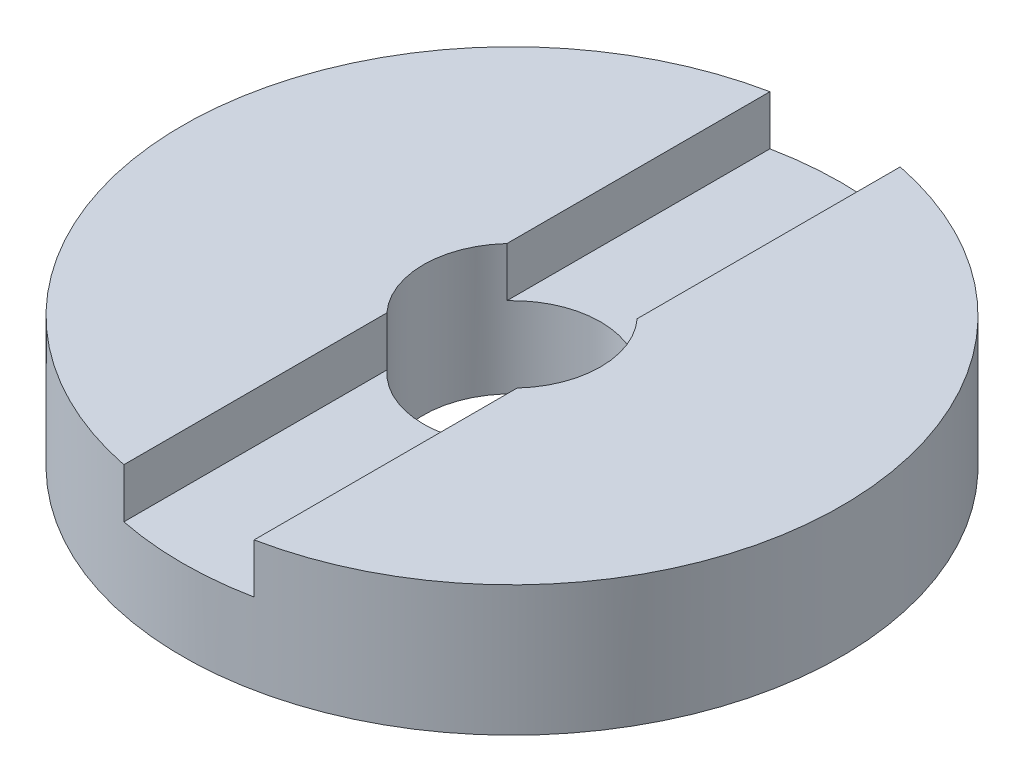
ISO-10303-21;
HEADER;
FILE_DESCRIPTION(('STEP AP214'),'2;1');
FILE_NAME('part.step','',(''),(''),'','','');
FILE_SCHEMA(('AUTOMOTIVE_DESIGN { 1 0 10303 214 1 1 1 1 }'));
ENDSEC;
DATA;
#1=APPLICATION_CONTEXT('core data for automotive mechanical design processes');
#2=APPLICATION_PROTOCOL_DEFINITION('international standard','automotive_design',2000,#1);
#3=PRODUCT_CONTEXT('',#1,'mechanical');
#4=PRODUCT('Part','Part','',(#3));
#5=PRODUCT_RELATED_PRODUCT_CATEGORY('part','',(#4));
#6=PRODUCT_DEFINITION_FORMATION('','',#4);
#7=PRODUCT_DEFINITION_CONTEXT('part definition',#1,'design');
#8=PRODUCT_DEFINITION('design','',#6,#7);
#9=PRODUCT_DEFINITION_SHAPE('','',#8);
#10=(LENGTH_UNIT() NAMED_UNIT(*) SI_UNIT(.MILLI.,.METRE.));
#11=(NAMED_UNIT(*) PLANE_ANGLE_UNIT() SI_UNIT($,.RADIAN.));
#12=(NAMED_UNIT(*) SI_UNIT($,.STERADIAN.) SOLID_ANGLE_UNIT());
#13=UNCERTAINTY_MEASURE_WITH_UNIT(LENGTH_MEASURE(1.E-05),#10,'distance_accuracy_value','');
#14=(GEOMETRIC_REPRESENTATION_CONTEXT(3) GLOBAL_UNCERTAINTY_ASSIGNED_CONTEXT((#13)) GLOBAL_UNIT_ASSIGNED_CONTEXT((#10,
#11,#12)) REPRESENTATION_CONTEXT('',''));
#15=CARTESIAN_POINT('',(0.,0.,0.));
#16=DIRECTION('',(0.,0.,1.));
#17=DIRECTION('',(1.,0.,0.));
#18=AXIS2_PLACEMENT_3D('',#15,#16,#17);
#19=CARTESIAN_POINT('',(-2.5,3.1,-12.4005040220146));
#20=DIRECTION('',(-1.,0.,0.));
#21=DIRECTION('',(0.,0.,1.));
#22=AXIS2_PLACEMENT_3D('',#19,#20,#21);
#23=PLANE('',#22);
#24=DIRECTION('',(0.,0.,1.));
#25=VECTOR('',#24,1.);
#26=CARTESIAN_POINT('',(-2.5,5.,-12.4005040220146));
#27=LINE('',#26,#25);
#28=CARTESIAN_POINT('',(-2.5,5.,-12.4005040220146));
#29=VERTEX_POINT('',#28);
#30=CARTESIAN_POINT('',(-2.5,5.,-2.30434372436056));
#31=VERTEX_POINT('',#30);
#32=EDGE_CURVE('E124',#29,#31,#27,.T.);
#33=ORIENTED_EDGE('',*,*,#32,.T.);
#34=DIRECTION('',(0.,-1.,0.));
#35=VECTOR('',#34,1.);
#36=CARTESIAN_POINT('',(-2.5,0.,-2.30434372436056));
#37=LINE('',#36,#35);
#38=CARTESIAN_POINT('',(-2.5,3.1,-2.30434372436056));
#39=VERTEX_POINT('',#38);
#40=EDGE_CURVE('E156',#31,#39,#37,.T.);
#41=ORIENTED_EDGE('',*,*,#40,.T.);
#42=DIRECTION('',(0.,0.,1.));
#43=VECTOR('',#42,1.);
#44=CARTESIAN_POINT('',(-2.5,3.1,-12.4005040220146));
#45=LINE('',#44,#43);
#46=CARTESIAN_POINT('',(-2.5,3.1,-12.4005040220146));
#47=VERTEX_POINT('',#46);
#48=EDGE_CURVE('E117',#47,#39,#45,.T.);
#49=ORIENTED_EDGE('',*,*,#48,.F.);
#50=DIRECTION('',(0.,1.,0.));
#51=VECTOR('',#50,1.);
#52=CARTESIAN_POINT('',(-2.5,3.1,-12.4005040220146));
#53=LINE('',#52,#51);
#54=EDGE_CURVE('E131',#47,#29,#53,.T.);
#55=ORIENTED_EDGE('',*,*,#54,.T.);
#56=EDGE_LOOP('',(#33,#41,#49,#55));
#57=FACE_BOUND('',#56,.T.);
#58=ADVANCED_FACE('F30',(#57),#23,.F.);
#59=CARTESIAN_POINT('',(2.5,3.1,-12.4005040220146));
#60=DIRECTION('',(1.,0.,0.));
#61=DIRECTION('',(0.,0.,-1.));
#62=AXIS2_PLACEMENT_3D('',#59,#60,#61);
#63=PLANE('',#62);
#64=DIRECTION('',(0.,0.,-1.));
#65=VECTOR('',#64,1.);
#66=CARTESIAN_POINT('',(2.5,5.,-12.4005040220146));
#67=LINE('',#66,#65);
#68=CARTESIAN_POINT('',(2.5,5.,12.4005040220146));
#69=VERTEX_POINT('',#68);
#70=CARTESIAN_POINT('',(2.5,5.,2.30434372436056));
#71=VERTEX_POINT('',#70);
#72=EDGE_CURVE('E52',#69,#71,#67,.T.);
#73=ORIENTED_EDGE('',*,*,#72,.T.);
#74=DIRECTION('',(0.,-1.,0.));
#75=VECTOR('',#74,1.);
#76=CARTESIAN_POINT('',(2.5,0.,2.30434372436056));
#77=LINE('',#76,#75);
#78=CARTESIAN_POINT('',(2.5,3.1,2.30434372436056));
#79=VERTEX_POINT('',#78);
#80=EDGE_CURVE('E95',#71,#79,#77,.T.);
#81=ORIENTED_EDGE('',*,*,#80,.T.);
#82=DIRECTION('',(0.,0.,-1.));
#83=VECTOR('',#82,1.);
#84=CARTESIAN_POINT('',(2.5,3.1,-12.4005040220146));
#85=LINE('',#84,#83);
#86=CARTESIAN_POINT('',(2.5,3.1,12.4005040220146));
#87=VERTEX_POINT('',#86);
#88=EDGE_CURVE('E101',#87,#79,#85,.T.);
#89=ORIENTED_EDGE('',*,*,#88,.F.);
#90=DIRECTION('',(0.,1.,0.));
#91=VECTOR('',#90,1.);
#92=CARTESIAN_POINT('',(2.5,3.1,12.4005040220146));
#93=LINE('',#92,#91);
#94=EDGE_CURVE('E120',#87,#69,#93,.T.);
#95=ORIENTED_EDGE('',*,*,#94,.T.);
#96=EDGE_LOOP('',(#73,#81,#89,#95));
#97=FACE_BOUND('',#96,.T.);
#98=ADVANCED_FACE('F100',(#97),#63,.F.);
#99=CARTESIAN_POINT('',(-12.65,5.,0.));
#100=DIRECTION('',(0.,-1.,0.));
#101=DIRECTION('',(0.,0.,-1.));
#102=AXIS2_PLACEMENT_3D('',#99,#100,#101);
#103=PLANE('',#102);
#104=CARTESIAN_POINT('',(-2.5,5.,2.30434372436056));
#105=VERTEX_POINT('',#104);
#106=CARTESIAN_POINT('',(-2.5,5.,12.4005040220146));
#107=VERTEX_POINT('',#106);
#108=EDGE_CURVE('E122',#105,#107,#27,.T.);
#109=ORIENTED_EDGE('',*,*,#108,.F.);
#110=CARTESIAN_POINT('',(0.,5.,0.));
#111=DIRECTION('',(0.,-1.,0.));
#112=DIRECTION('',(0.,0.,-1.));
#113=AXIS2_PLACEMENT_3D('',#110,#111,#112);
#114=CIRCLE('',#113,3.39999999999999);
#115=EDGE_CURVE('E152',#105,#31,#114,.T.);
#116=ORIENTED_EDGE('',*,*,#115,.T.);
#117=ORIENTED_EDGE('',*,*,#32,.F.);
#118=CARTESIAN_POINT('',(0.,5.,0.));
#119=DIRECTION('',(0.,-1.,0.));
#120=DIRECTION('',(0.,0.,-1.));
#121=AXIS2_PLACEMENT_3D('',#118,#119,#120);
#122=CIRCLE('',#121,12.65);
#123=EDGE_CURVE('E138',#107,#29,#122,.T.);
#124=ORIENTED_EDGE('',*,*,#123,.F.);
#125=EDGE_LOOP('',(#109,#116,#117,#124));
#126=FACE_BOUND('',#125,.T.);
#127=ADVANCED_FACE('F150',(#126),#103,.F.);
#128=CARTESIAN_POINT('',(0.,0.,0.));
#129=DIRECTION('',(0.,-1.,0.));
#130=DIRECTION('',(0.,0.,-1.));
#131=AXIS2_PLACEMENT_3D('',#128,#129,#130);
#132=CYLINDRICAL_SURFACE('',#131,12.65);
#133=ORIENTED_EDGE('',*,*,#123,.T.);
#134=ORIENTED_EDGE('',*,*,#54,.F.);
#135=CARTESIAN_POINT('',(0.,3.1,0.));
#136=DIRECTION('',(0.,1.,0.));
#137=DIRECTION('',(0.,0.,1.));
#138=AXIS2_PLACEMENT_3D('',#135,#136,#137);
#139=CIRCLE('',#138,12.65);
#140=CARTESIAN_POINT('',(2.5,3.1,-12.4005040220146));
#141=VERTEX_POINT('',#140);
#142=EDGE_CURVE('E109',#141,#47,#139,.T.);
#143=ORIENTED_EDGE('',*,*,#142,.F.);
#144=DIRECTION('',(0.,1.,0.));
#145=VECTOR('',#144,1.);
#146=CARTESIAN_POINT('',(2.5,3.1,-12.4005040220146));
#147=LINE('',#146,#145);
#148=CARTESIAN_POINT('',(2.5,5.,-12.4005040220146));
#149=VERTEX_POINT('',#148);
#150=EDGE_CURVE('E133',#141,#149,#147,.T.);
#151=ORIENTED_EDGE('',*,*,#150,.T.);
#152=EDGE_CURVE('E38',#149,#69,#122,.T.);
#153=ORIENTED_EDGE('',*,*,#152,.T.);
#154=ORIENTED_EDGE('',*,*,#94,.F.);
#155=CARTESIAN_POINT('',(0.,3.1,0.));
#156=DIRECTION('',(0.,1.,0.));
#157=DIRECTION('',(0.,0.,1.));
#158=AXIS2_PLACEMENT_3D('',#155,#156,#157);
#159=CIRCLE('',#158,12.65);
#160=CARTESIAN_POINT('',(-2.5,3.1,12.4005040220146));
#161=VERTEX_POINT('',#160);
#162=EDGE_CURVE('E107',#161,#87,#159,.T.);
#163=ORIENTED_EDGE('',*,*,#162,.F.);
#164=DIRECTION('',(0.,1.,0.));
#165=VECTOR('',#164,1.);
#166=CARTESIAN_POINT('',(-2.5,3.1,12.4005040220146));
#167=LINE('',#166,#165);
#168=EDGE_CURVE('E127',#161,#107,#167,.T.);
#169=ORIENTED_EDGE('',*,*,#168,.T.);
#170=EDGE_LOOP('',(#133,#134,#143,#151,#153,#154,#163,#169));
#171=FACE_BOUND('',#170,.T.);
#172=CARTESIAN_POINT('',(0.,0.,0.));
#173=DIRECTION('',(0.,-1.,0.));
#174=DIRECTION('',(0.,0.,-1.));
#175=AXIS2_PLACEMENT_3D('',#172,#173,#174);
#176=CIRCLE('',#175,12.65);
#177=CARTESIAN_POINT('',(0.,0.,-12.65));
#178=VERTEX_POINT('',#177);
#179=EDGE_CURVE('E130',#178,#178,#176,.T.);
#180=ORIENTED_EDGE('',*,*,#179,.F.);
#181=EDGE_LOOP('',(#180));
#182=FACE_BOUND('',#181,.T.);
#183=ADVANCED_FACE('F32',(#171,#182),#132,.T.);
#184=CARTESIAN_POINT('',(2.5,5.,-2.30434372436057));
#185=VERTEX_POINT('',#184);
#186=EDGE_CURVE('E123',#185,#149,#67,.T.);
#187=ORIENTED_EDGE('',*,*,#186,.F.);
#188=CARTESIAN_POINT('',(0.,5.,0.));
#189=DIRECTION('',(0.,-1.,0.));
#190=DIRECTION('',(0.,0.,-1.));
#191=AXIS2_PLACEMENT_3D('',#188,#189,#190);
#192=CIRCLE('',#191,3.39999999999999);
#193=EDGE_CURVE('E166',#185,#71,#192,.T.);
#194=ORIENTED_EDGE('',*,*,#193,.T.);
#195=ORIENTED_EDGE('',*,*,#72,.F.);
#196=ORIENTED_EDGE('',*,*,#152,.F.);
#197=EDGE_LOOP('',(#187,#194,#195,#196));
#198=FACE_BOUND('',#197,.T.);
#199=ADVANCED_FACE('F165',(#198),#103,.F.);
#200=CARTESIAN_POINT('',(-2.5,0.,0.));
#201=DIRECTION('',(0.,1.,0.));
#202=DIRECTION('',(0.,0.,1.));
#203=AXIS2_PLACEMENT_3D('',#200,#201,#202);
#204=PLANE('',#203);
#205=CARTESIAN_POINT('',(0.,0.,0.));
#206=DIRECTION('',(0.,-1.,0.));
#207=DIRECTION('',(0.,0.,-1.));
#208=AXIS2_PLACEMENT_3D('',#205,#206,#207);
#209=CIRCLE('',#208,3.39999999999999);
#210=CARTESIAN_POINT('',(0.,0.,-3.39999999999999));
#211=VERTEX_POINT('',#210);
#212=EDGE_CURVE('E103',#211,#211,#209,.T.);
#213=ORIENTED_EDGE('',*,*,#212,.F.);
#214=EDGE_LOOP('',(#213));
#215=FACE_BOUND('',#214,.T.);
#216=ORIENTED_EDGE('',*,*,#179,.T.);
#217=EDGE_LOOP('',(#216));
#218=FACE_BOUND('',#217,.T.);
#219=ADVANCED_FACE('F179',(#215,#218),#204,.F.);
#220=CARTESIAN_POINT('',(-2.5,3.1,2.30434372436057));
#221=VERTEX_POINT('',#220);
#222=EDGE_CURVE('E112',#221,#161,#45,.T.);
#223=ORIENTED_EDGE('',*,*,#222,.F.);
#224=DIRECTION('',(0.,-1.,0.));
#225=VECTOR('',#224,1.);
#226=CARTESIAN_POINT('',(-2.5,0.,2.30434372436056));
#227=LINE('',#226,#225);
#228=EDGE_CURVE('E44',#221,#105,#227,.F.);
#229=ORIENTED_EDGE('',*,*,#228,.T.);
#230=ORIENTED_EDGE('',*,*,#108,.T.);
#231=ORIENTED_EDGE('',*,*,#168,.F.);
#232=EDGE_LOOP('',(#223,#229,#230,#231));
#233=FACE_BOUND('',#232,.T.);
#234=ADVANCED_FACE('F182',(#233),#23,.F.);
#235=CARTESIAN_POINT('',(2.5,3.1,-2.30434372436057));
#236=VERTEX_POINT('',#235);
#237=EDGE_CURVE('E110',#236,#141,#85,.T.);
#238=ORIENTED_EDGE('',*,*,#237,.F.);
#239=DIRECTION('',(0.,-1.,0.));
#240=VECTOR('',#239,1.);
#241=CARTESIAN_POINT('',(2.5,0.,-2.30434372436057));
#242=LINE('',#241,#240);
#243=EDGE_CURVE('E168',#236,#185,#242,.F.);
#244=ORIENTED_EDGE('',*,*,#243,.T.);
#245=ORIENTED_EDGE('',*,*,#186,.T.);
#246=ORIENTED_EDGE('',*,*,#150,.F.);
#247=EDGE_LOOP('',(#238,#244,#245,#246));
#248=FACE_BOUND('',#247,.T.);
#249=ADVANCED_FACE('F196',(#248),#63,.F.);
#250=CARTESIAN_POINT('',(0.,3.1,0.));
#251=DIRECTION('',(0.,1.,0.));
#252=DIRECTION('',(0.,0.,1.));
#253=AXIS2_PLACEMENT_3D('',#250,#251,#252);
#254=PLANE('',#253);
#255=CARTESIAN_POINT('',(0.,3.1,0.));
#256=DIRECTION('',(0.,1.,0.));
#257=DIRECTION('',(0.,0.,1.));
#258=AXIS2_PLACEMENT_3D('',#255,#256,#257);
#259=CIRCLE('',#258,3.39999999999999);
#260=EDGE_CURVE('E160',#236,#39,#259,.T.);
#261=ORIENTED_EDGE('',*,*,#260,.F.);
#262=ORIENTED_EDGE('',*,*,#237,.T.);
#263=ORIENTED_EDGE('',*,*,#142,.T.);
#264=ORIENTED_EDGE('',*,*,#48,.T.);
#265=EDGE_LOOP('',(#261,#262,#263,#264));
#266=FACE_BOUND('',#265,.T.);
#267=ADVANCED_FACE('F159',(#266),#254,.T.);
#268=CARTESIAN_POINT('',(0.,3.1,0.));
#269=DIRECTION('',(0.,1.,0.));
#270=DIRECTION('',(0.,0.,1.));
#271=AXIS2_PLACEMENT_3D('',#268,#269,#270);
#272=CIRCLE('',#271,3.39999999999999);
#273=EDGE_CURVE('E11',#221,#79,#272,.T.);
#274=ORIENTED_EDGE('',*,*,#273,.F.);
#275=ORIENTED_EDGE('',*,*,#222,.T.);
#276=ORIENTED_EDGE('',*,*,#162,.T.);
#277=ORIENTED_EDGE('',*,*,#88,.T.);
#278=EDGE_LOOP('',(#274,#275,#276,#277));
#279=FACE_BOUND('',#278,.T.);
#280=ADVANCED_FACE('F105',(#279),#254,.T.);
#281=CARTESIAN_POINT('',(0.,0.,0.));
#282=DIRECTION('',(0.,-1.,0.));
#283=DIRECTION('',(0.,0.,-1.));
#284=AXIS2_PLACEMENT_3D('',#281,#282,#283);
#285=CYLINDRICAL_SURFACE('',#284,3.39999999999999);
#286=ORIENTED_EDGE('',*,*,#212,.T.);
#287=EDGE_LOOP('',(#286));
#288=FACE_BOUND('',#287,.T.);
#289=ORIENTED_EDGE('',*,*,#115,.F.);
#290=ORIENTED_EDGE('',*,*,#228,.F.);
#291=ORIENTED_EDGE('',*,*,#273,.T.);
#292=ORIENTED_EDGE('',*,*,#80,.F.);
#293=ORIENTED_EDGE('',*,*,#193,.F.);
#294=ORIENTED_EDGE('',*,*,#243,.F.);
#295=ORIENTED_EDGE('',*,*,#260,.T.);
#296=ORIENTED_EDGE('',*,*,#40,.F.);
#297=EDGE_LOOP('',(#289,#290,#291,#292,#293,#294,#295,#296));
#298=FACE_BOUND('',#297,.T.);
#299=ADVANCED_FACE('F94',(#288,#298),#285,.F.);
#300=CLOSED_SHELL('',(#58,#98,#127,#183,#199,#219,#234,#249,#267,#280,#299));
#301=MANIFOLD_SOLID_BREP('B2',#300);
#302=ADVANCED_BREP_SHAPE_REPRESENTATION('',(#18,#301),#14);
#303=SHAPE_DEFINITION_REPRESENTATION(#9,#302);
ENDSEC;
END-ISO-10303-21;
